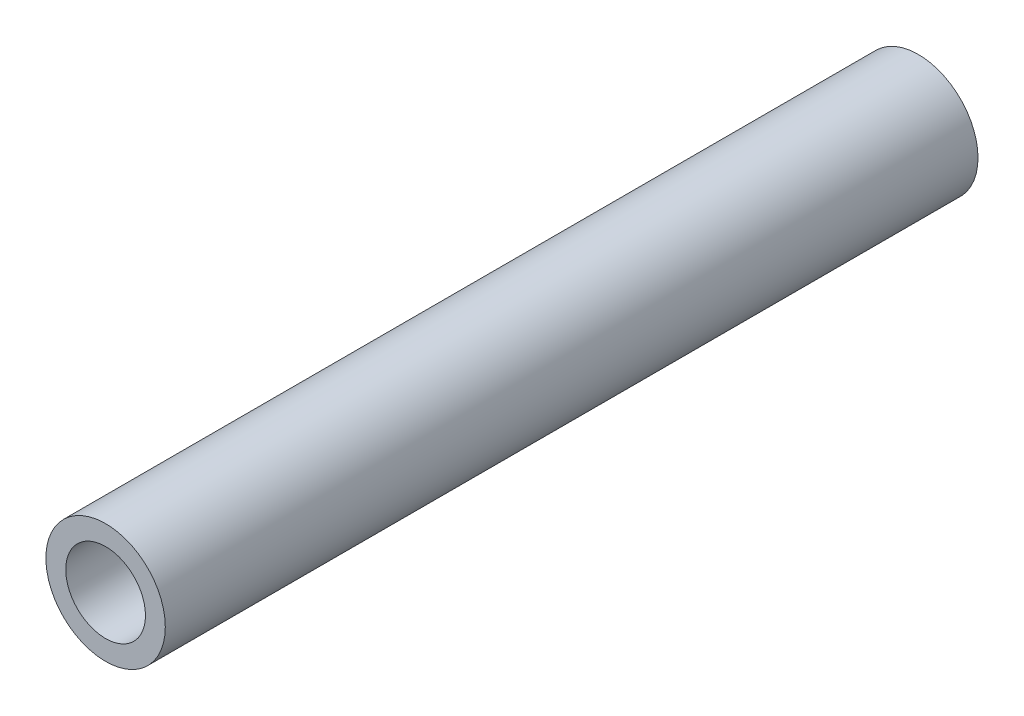
ISO-10303-21;
HEADER;
FILE_DESCRIPTION(('STEP AP214'),'2;1');
FILE_NAME('part.step','',(''),(''),'','','');
FILE_SCHEMA(('AUTOMOTIVE_DESIGN { 1 0 10303 214 1 1 1 1 }'));
ENDSEC;
DATA;
#1=APPLICATION_CONTEXT('core data for automotive mechanical design processes');
#2=APPLICATION_PROTOCOL_DEFINITION('international standard','automotive_design',2000,#1);
#3=PRODUCT_CONTEXT('',#1,'mechanical');
#4=PRODUCT('Part','Part','',(#3));
#5=PRODUCT_RELATED_PRODUCT_CATEGORY('part','',(#4));
#6=PRODUCT_DEFINITION_FORMATION('','',#4);
#7=PRODUCT_DEFINITION_CONTEXT('part definition',#1,'design');
#8=PRODUCT_DEFINITION('design','',#6,#7);
#9=PRODUCT_DEFINITION_SHAPE('','',#8);
#10=(LENGTH_UNIT() NAMED_UNIT(*) SI_UNIT(.MILLI.,.METRE.));
#11=(NAMED_UNIT(*) PLANE_ANGLE_UNIT() SI_UNIT($,.RADIAN.));
#12=(NAMED_UNIT(*) SI_UNIT($,.STERADIAN.) SOLID_ANGLE_UNIT());
#13=UNCERTAINTY_MEASURE_WITH_UNIT(LENGTH_MEASURE(1.E-05),#10,'distance_accuracy_value','');
#14=(GEOMETRIC_REPRESENTATION_CONTEXT(3) GLOBAL_UNCERTAINTY_ASSIGNED_CONTEXT((#13)) GLOBAL_UNIT_ASSIGNED_CONTEXT((#10,
#11,#12)) REPRESENTATION_CONTEXT('',''));
#15=CARTESIAN_POINT('',(0.,0.,0.));
#16=DIRECTION('',(0.,0.,1.));
#17=DIRECTION('',(1.,0.,0.));
#18=AXIS2_PLACEMENT_3D('',#15,#16,#17);
#19=CARTESIAN_POINT('',(0.,0.,162.052));
#20=DIRECTION('',(0.,0.,1.));
#21=DIRECTION('',(1.,0.,0.));
#22=AXIS2_PLACEMENT_3D('',#19,#20,#21);
#23=PLANE('',#22);
#24=CARTESIAN_POINT('',(0.,0.,162.052));
#25=DIRECTION('',(0.,0.,1.));
#26=DIRECTION('',(1.,0.,0.));
#27=AXIS2_PLACEMENT_3D('',#24,#25,#26);
#28=CIRCLE('',#27,11.90625);
#29=CARTESIAN_POINT('',(11.90625,0.,162.052));
#30=VERTEX_POINT('',#29);
#31=EDGE_CURVE('E10',#30,#30,#28,.T.);
#32=ORIENTED_EDGE('',*,*,#31,.T.);
#33=EDGE_LOOP('',(#32));
#34=FACE_BOUND('',#33,.T.);
#35=CARTESIAN_POINT('',(0.,0.,162.052));
#36=DIRECTION('',(0.,0.,1.));
#37=DIRECTION('',(1.,0.,0.));
#38=AXIS2_PLACEMENT_3D('',#35,#36,#37);
#39=CIRCLE('',#38,7.9502);
#40=CARTESIAN_POINT('',(7.9502,0.,162.052));
#41=VERTEX_POINT('',#40);
#42=EDGE_CURVE('E41',#41,#41,#39,.T.);
#43=ORIENTED_EDGE('',*,*,#42,.F.);
#44=EDGE_LOOP('',(#43));
#45=FACE_BOUND('',#44,.T.);
#46=ADVANCED_FACE('F30',(#34,#45),#23,.T.);
#47=CARTESIAN_POINT('',(0.,0.,0.));
#48=DIRECTION('',(0.,0.,1.));
#49=DIRECTION('',(1.,0.,0.));
#50=AXIS2_PLACEMENT_3D('',#47,#48,#49);
#51=PLANE('',#50);
#52=CARTESIAN_POINT('',(0.,0.,0.));
#53=DIRECTION('',(0.,0.,1.));
#54=DIRECTION('',(1.,0.,0.));
#55=AXIS2_PLACEMENT_3D('',#52,#53,#54);
#56=CIRCLE('',#55,11.90625);
#57=CARTESIAN_POINT('',(11.90625,0.,0.));
#58=VERTEX_POINT('',#57);
#59=EDGE_CURVE('E34',#58,#58,#56,.T.);
#60=ORIENTED_EDGE('',*,*,#59,.F.);
#61=EDGE_LOOP('',(#60));
#62=FACE_BOUND('',#61,.T.);
#63=CARTESIAN_POINT('',(0.,0.,0.));
#64=DIRECTION('',(0.,0.,1.));
#65=DIRECTION('',(1.,0.,0.));
#66=AXIS2_PLACEMENT_3D('',#63,#64,#65);
#67=CIRCLE('',#66,7.9502);
#68=CARTESIAN_POINT('',(7.9502,0.,0.));
#69=VERTEX_POINT('',#68);
#70=EDGE_CURVE('E43',#69,#69,#67,.T.);
#71=ORIENTED_EDGE('',*,*,#70,.T.);
#72=EDGE_LOOP('',(#71));
#73=FACE_BOUND('',#72,.T.);
#74=ADVANCED_FACE('F53',(#62,#73),#51,.F.);
#75=CARTESIAN_POINT('',(0.,0.,162.052));
#76=DIRECTION('',(0.,0.,-1.));
#77=DIRECTION('',(-1.,0.,0.));
#78=AXIS2_PLACEMENT_3D('',#75,#76,#77);
#79=CYLINDRICAL_SURFACE('',#78,11.90625);
#80=ORIENTED_EDGE('',*,*,#31,.F.);
#81=EDGE_LOOP('',(#80));
#82=FACE_BOUND('',#81,.T.);
#83=ORIENTED_EDGE('',*,*,#59,.T.);
#84=EDGE_LOOP('',(#83));
#85=FACE_BOUND('',#84,.T.);
#86=ADVANCED_FACE('F32',(#82,#85),#79,.T.);
#87=CARTESIAN_POINT('',(0.,0.,162.052));
#88=DIRECTION('',(0.,0.,-1.));
#89=DIRECTION('',(-1.,0.,0.));
#90=AXIS2_PLACEMENT_3D('',#87,#88,#89);
#91=CYLINDRICAL_SURFACE('',#90,7.9502);
#92=ORIENTED_EDGE('',*,*,#42,.T.);
#93=EDGE_LOOP('',(#92));
#94=FACE_BOUND('',#93,.T.);
#95=ORIENTED_EDGE('',*,*,#70,.F.);
#96=EDGE_LOOP('',(#95));
#97=FACE_BOUND('',#96,.T.);
#98=ADVANCED_FACE('F49',(#94,#97),#91,.F.);
#99=CLOSED_SHELL('',(#46,#74,#86,#98));
#100=MANIFOLD_SOLID_BREP('B2',#99);
#101=ADVANCED_BREP_SHAPE_REPRESENTATION('',(#18,#100),#14);
#102=SHAPE_DEFINITION_REPRESENTATION(#9,#101);
ENDSEC;
END-ISO-10303-21;
